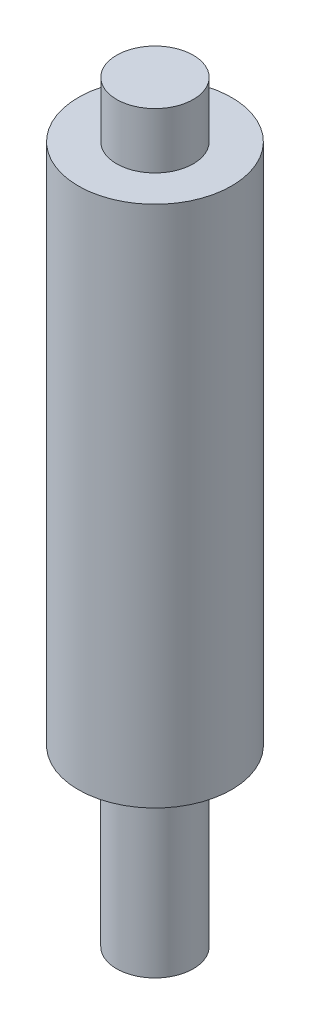
ISO-10303-21;
HEADER;
FILE_DESCRIPTION(('STEP AP214'),'2;1');
FILE_NAME('part.step','',(''),(''),'','','');
FILE_SCHEMA(('AUTOMOTIVE_DESIGN { 1 0 10303 214 1 1 1 1 }'));
ENDSEC;
DATA;
#1=APPLICATION_CONTEXT('core data for automotive mechanical design processes');
#2=APPLICATION_PROTOCOL_DEFINITION('international standard','automotive_design',2000,#1);
#3=PRODUCT_CONTEXT('',#1,'mechanical');
#4=PRODUCT('Part','Part','',(#3));
#5=PRODUCT_RELATED_PRODUCT_CATEGORY('part','',(#4));
#6=PRODUCT_DEFINITION_FORMATION('','',#4);
#7=PRODUCT_DEFINITION_CONTEXT('part definition',#1,'design');
#8=PRODUCT_DEFINITION('design','',#6,#7);
#9=PRODUCT_DEFINITION_SHAPE('','',#8);
#10=(LENGTH_UNIT() NAMED_UNIT(*) SI_UNIT(.MILLI.,.METRE.));
#11=(NAMED_UNIT(*) PLANE_ANGLE_UNIT() SI_UNIT($,.RADIAN.));
#12=(NAMED_UNIT(*) SI_UNIT($,.STERADIAN.) SOLID_ANGLE_UNIT());
#13=UNCERTAINTY_MEASURE_WITH_UNIT(LENGTH_MEASURE(1.E-05),#10,'distance_accuracy_value','');
#14=(GEOMETRIC_REPRESENTATION_CONTEXT(3) GLOBAL_UNCERTAINTY_ASSIGNED_CONTEXT((#13)) GLOBAL_UNIT_ASSIGNED_CONTEXT((#10,
#11,#12)) REPRESENTATION_CONTEXT('',''));
#15=CARTESIAN_POINT('',(0.,0.,0.));
#16=DIRECTION('',(0.,0.,1.));
#17=DIRECTION('',(1.,0.,0.));
#18=AXIS2_PLACEMENT_3D('',#15,#16,#17);
#19=CARTESIAN_POINT('',(0.,15.,0.));
#20=DIRECTION('',(0.,-1.,0.));
#21=DIRECTION('',(0.,0.,-1.));
#22=AXIS2_PLACEMENT_3D('',#19,#20,#21);
#23=CYLINDRICAL_SURFACE('',#22,2.2);
#24=CARTESIAN_POINT('',(0.,15.,0.));
#25=DIRECTION('',(0.,1.,0.));
#26=DIRECTION('',(0.,0.,1.));
#27=AXIS2_PLACEMENT_3D('',#24,#25,#26);
#28=CIRCLE('',#27,2.2);
#29=CARTESIAN_POINT('',(0.,15.,2.2));
#30=VERTEX_POINT('',#29);
#31=EDGE_CURVE('E45',#30,#30,#28,.T.);
#32=ORIENTED_EDGE('',*,*,#31,.F.);
#33=EDGE_LOOP('',(#32));
#34=FACE_BOUND('',#33,.T.);
#35=CARTESIAN_POINT('',(0.,0.,0.));
#36=DIRECTION('',(0.,1.,0.));
#37=DIRECTION('',(0.,0.,1.));
#38=AXIS2_PLACEMENT_3D('',#35,#36,#37);
#39=CIRCLE('',#38,2.2);
#40=CARTESIAN_POINT('',(0.,0.,2.2));
#41=VERTEX_POINT('',#40);
#42=EDGE_CURVE('E36',#41,#41,#39,.T.);
#43=ORIENTED_EDGE('',*,*,#42,.T.);
#44=EDGE_LOOP('',(#43));
#45=FACE_BOUND('',#44,.T.);
#46=ADVANCED_FACE('F33',(#34,#45),#23,.T.);
#47=CARTESIAN_POINT('',(0.,15.,0.));
#48=DIRECTION('',(0.,1.,0.));
#49=DIRECTION('',(0.,0.,1.));
#50=AXIS2_PLACEMENT_3D('',#47,#48,#49);
#51=PLANE('',#50);
#52=CARTESIAN_POINT('',(0.,15.,0.));
#53=DIRECTION('',(0.,1.,0.));
#54=DIRECTION('',(0.,0.,1.));
#55=AXIS2_PLACEMENT_3D('',#52,#53,#54);
#56=CIRCLE('',#55,1.1);
#57=CARTESIAN_POINT('',(0.,15.,1.1));
#58=VERTEX_POINT('',#57);
#59=EDGE_CURVE('E40',#58,#58,#56,.T.);
#60=ORIENTED_EDGE('',*,*,#59,.F.);
#61=EDGE_LOOP('',(#60));
#62=FACE_BOUND('',#61,.T.);
#63=ORIENTED_EDGE('',*,*,#31,.T.);
#64=EDGE_LOOP('',(#63));
#65=FACE_BOUND('',#64,.T.);
#66=ADVANCED_FACE('F62',(#62,#65),#51,.T.);
#67=CARTESIAN_POINT('',(0.,0.,0.));
#68=DIRECTION('',(0.,1.,0.));
#69=DIRECTION('',(0.,0.,1.));
#70=AXIS2_PLACEMENT_3D('',#67,#68,#69);
#71=PLANE('',#70);
#72=CARTESIAN_POINT('',(0.,0.,0.));
#73=DIRECTION('',(0.,-1.,0.));
#74=DIRECTION('',(0.,0.,-1.));
#75=AXIS2_PLACEMENT_3D('',#72,#73,#74);
#76=CIRCLE('',#75,1.1);
#77=CARTESIAN_POINT('',(0.,0.,-1.1));
#78=VERTEX_POINT('',#77);
#79=EDGE_CURVE('E10',#78,#78,#76,.T.);
#80=ORIENTED_EDGE('',*,*,#79,.F.);
#81=EDGE_LOOP('',(#80));
#82=FACE_BOUND('',#81,.T.);
#83=ORIENTED_EDGE('',*,*,#42,.F.);
#84=EDGE_LOOP('',(#83));
#85=FACE_BOUND('',#84,.T.);
#86=ADVANCED_FACE('F59',(#82,#85),#71,.F.);
#87=CARTESIAN_POINT('',(0.,16.6,0.));
#88=DIRECTION('',(0.,-1.,0.));
#89=DIRECTION('',(0.,0.,-1.));
#90=AXIS2_PLACEMENT_3D('',#87,#88,#89);
#91=CYLINDRICAL_SURFACE('',#90,1.1);
#92=CARTESIAN_POINT('',(0.,16.6,0.));
#93=DIRECTION('',(0.,1.,0.));
#94=DIRECTION('',(0.,0.,1.));
#95=AXIS2_PLACEMENT_3D('',#92,#93,#94);
#96=CIRCLE('',#95,1.1);
#97=CARTESIAN_POINT('',(0.,16.6,1.1));
#98=VERTEX_POINT('',#97);
#99=EDGE_CURVE('E50',#98,#98,#96,.T.);
#100=ORIENTED_EDGE('',*,*,#99,.F.);
#101=EDGE_LOOP('',(#100));
#102=FACE_BOUND('',#101,.T.);
#103=ORIENTED_EDGE('',*,*,#59,.T.);
#104=EDGE_LOOP('',(#103));
#105=FACE_BOUND('',#104,.T.);
#106=ADVANCED_FACE('F61',(#102,#105),#91,.T.);
#107=CARTESIAN_POINT('',(0.,16.6,0.));
#108=DIRECTION('',(0.,1.,0.));
#109=DIRECTION('',(0.,0.,1.));
#110=AXIS2_PLACEMENT_3D('',#107,#108,#109);
#111=PLANE('',#110);
#112=ORIENTED_EDGE('',*,*,#99,.T.);
#113=EDGE_LOOP('',(#112));
#114=FACE_BOUND('',#113,.T.);
#115=ADVANCED_FACE('F68',(#114),#111,.T.);
#116=CARTESIAN_POINT('',(0.,-5.,0.));
#117=DIRECTION('',(0.,1.,0.));
#118=DIRECTION('',(0.,0.,1.));
#119=AXIS2_PLACEMENT_3D('',#116,#117,#118);
#120=CYLINDRICAL_SURFACE('',#119,1.1);
#121=CARTESIAN_POINT('',(0.,-5.,0.));
#122=DIRECTION('',(0.,-1.,0.));
#123=DIRECTION('',(0.,0.,-1.));
#124=AXIS2_PLACEMENT_3D('',#121,#122,#123);
#125=CIRCLE('',#124,1.1);
#126=CARTESIAN_POINT('',(0.,-5.,-1.1));
#127=VERTEX_POINT('',#126);
#128=EDGE_CURVE('E49',#127,#127,#125,.T.);
#129=ORIENTED_EDGE('',*,*,#128,.F.);
#130=EDGE_LOOP('',(#129));
#131=FACE_BOUND('',#130,.T.);
#132=ORIENTED_EDGE('',*,*,#79,.T.);
#133=EDGE_LOOP('',(#132));
#134=FACE_BOUND('',#133,.T.);
#135=ADVANCED_FACE('F96',(#131,#134),#120,.T.);
#136=CARTESIAN_POINT('',(0.,-5.,0.));
#137=DIRECTION('',(0.,-1.,0.));
#138=DIRECTION('',(0.,0.,-1.));
#139=AXIS2_PLACEMENT_3D('',#136,#137,#138);
#140=PLANE('',#139);
#141=ORIENTED_EDGE('',*,*,#128,.T.);
#142=EDGE_LOOP('',(#141));
#143=FACE_BOUND('',#142,.T.);
#144=ADVANCED_FACE('F110',(#143),#140,.T.);
#145=CLOSED_SHELL('',(#46,#66,#86,#106,#115,#135,#144));
#146=MANIFOLD_SOLID_BREP('B2',#145);
#147=ADVANCED_BREP_SHAPE_REPRESENTATION('',(#18,#146),#14);
#148=SHAPE_DEFINITION_REPRESENTATION(#9,#147);
ENDSEC;
END-ISO-10303-21;
